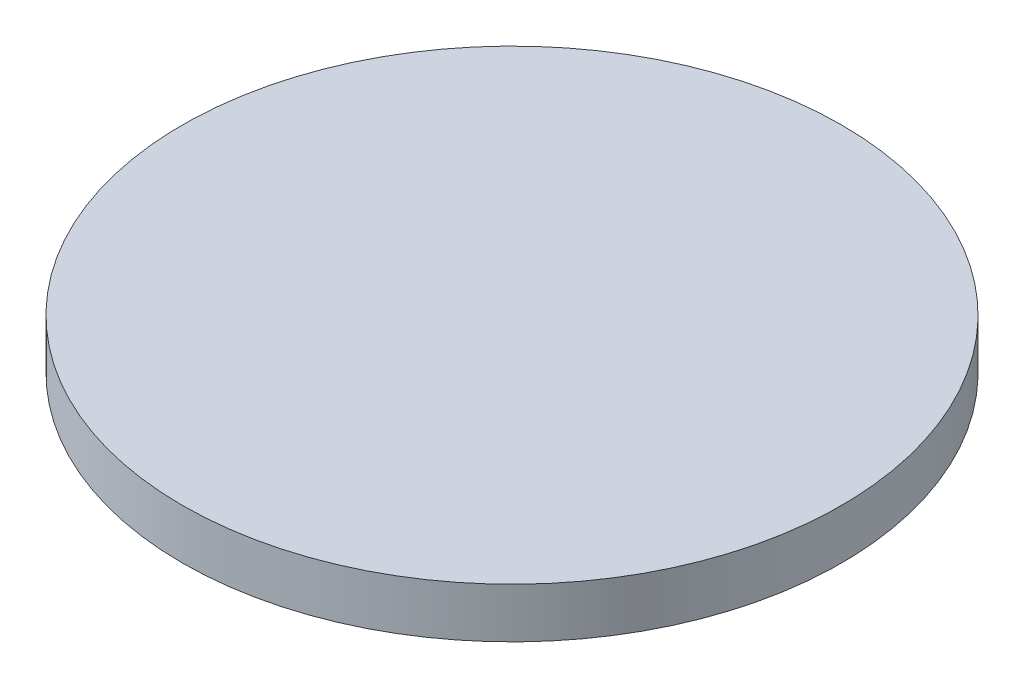
ISO-10303-21;
HEADER;
FILE_DESCRIPTION(('STEP AP214'),'2;1');
FILE_NAME('part.step','',(''),(''),'','','');
FILE_SCHEMA(('AUTOMOTIVE_DESIGN { 1 0 10303 214 1 1 1 1 }'));
ENDSEC;
DATA;
#1=APPLICATION_CONTEXT('core data for automotive mechanical design processes');
#2=APPLICATION_PROTOCOL_DEFINITION('international standard','automotive_design',2000,#1);
#3=PRODUCT_CONTEXT('',#1,'mechanical');
#4=PRODUCT('Part','Part','',(#3));
#5=PRODUCT_RELATED_PRODUCT_CATEGORY('part','',(#4));
#6=PRODUCT_DEFINITION_FORMATION('','',#4);
#7=PRODUCT_DEFINITION_CONTEXT('part definition',#1,'design');
#8=PRODUCT_DEFINITION('design','',#6,#7);
#9=PRODUCT_DEFINITION_SHAPE('','',#8);
#10=(LENGTH_UNIT() NAMED_UNIT(*) SI_UNIT(.MILLI.,.METRE.));
#11=(NAMED_UNIT(*) PLANE_ANGLE_UNIT() SI_UNIT($,.RADIAN.));
#12=(NAMED_UNIT(*) SI_UNIT($,.STERADIAN.) SOLID_ANGLE_UNIT());
#13=UNCERTAINTY_MEASURE_WITH_UNIT(LENGTH_MEASURE(1.E-05),#10,'distance_accuracy_value','');
#14=(GEOMETRIC_REPRESENTATION_CONTEXT(3) GLOBAL_UNCERTAINTY_ASSIGNED_CONTEXT((#13)) GLOBAL_UNIT_ASSIGNED_CONTEXT((#10,
#11,#12)) REPRESENTATION_CONTEXT('',''));
#15=CARTESIAN_POINT('',(0.,0.,0.));
#16=DIRECTION('',(0.,0.,1.));
#17=DIRECTION('',(1.,0.,0.));
#18=AXIS2_PLACEMENT_3D('',#15,#16,#17);
#19=CARTESIAN_POINT('',(0.,5.,0.));
#20=DIRECTION('',(0.,-1.,0.));
#21=DIRECTION('',(0.,0.,-1.));
#22=AXIS2_PLACEMENT_3D('',#19,#20,#21);
#23=CYLINDRICAL_SURFACE('',#22,33.);
#24=CARTESIAN_POINT('',(0.,5.,0.));
#25=DIRECTION('',(0.,1.,0.));
#26=DIRECTION('',(0.,0.,1.));
#27=AXIS2_PLACEMENT_3D('',#24,#25,#26);
#28=CIRCLE('',#27,33.);
#29=CARTESIAN_POINT('',(0.,5.,33.));
#30=VERTEX_POINT('',#29);
#31=EDGE_CURVE('E10',#30,#30,#28,.T.);
#32=ORIENTED_EDGE('',*,*,#31,.F.);
#33=EDGE_LOOP('',(#32));
#34=FACE_BOUND('',#33,.T.);
#35=CARTESIAN_POINT('',(0.,0.,0.));
#36=DIRECTION('',(0.,1.,0.));
#37=DIRECTION('',(0.,0.,1.));
#38=AXIS2_PLACEMENT_3D('',#35,#36,#37);
#39=CIRCLE('',#38,33.);
#40=CARTESIAN_POINT('',(0.,0.,33.));
#41=VERTEX_POINT('',#40);
#42=EDGE_CURVE('E34',#41,#41,#39,.T.);
#43=ORIENTED_EDGE('',*,*,#42,.T.);
#44=EDGE_LOOP('',(#43));
#45=FACE_BOUND('',#44,.T.);
#46=ADVANCED_FACE('F31',(#34,#45),#23,.T.);
#47=CARTESIAN_POINT('',(0.,5.,0.));
#48=DIRECTION('',(0.,1.,0.));
#49=DIRECTION('',(0.,0.,1.));
#50=AXIS2_PLACEMENT_3D('',#47,#48,#49);
#51=PLANE('',#50);
#52=ORIENTED_EDGE('',*,*,#31,.T.);
#53=EDGE_LOOP('',(#52));
#54=FACE_BOUND('',#53,.T.);
#55=ADVANCED_FACE('F46',(#54),#51,.T.);
#56=CARTESIAN_POINT('',(0.,0.,0.));
#57=DIRECTION('',(0.,1.,0.));
#58=DIRECTION('',(0.,0.,1.));
#59=AXIS2_PLACEMENT_3D('',#56,#57,#58);
#60=PLANE('',#59);
#61=ORIENTED_EDGE('',*,*,#42,.F.);
#62=EDGE_LOOP('',(#61));
#63=FACE_BOUND('',#62,.T.);
#64=ADVANCED_FACE('F44',(#63),#60,.F.);
#65=CLOSED_SHELL('',(#46,#55,#64));
#66=MANIFOLD_SOLID_BREP('B2',#65);
#67=ADVANCED_BREP_SHAPE_REPRESENTATION('',(#18,#66),#14);
#68=SHAPE_DEFINITION_REPRESENTATION(#9,#67);
ENDSEC;
END-ISO-10303-21;
